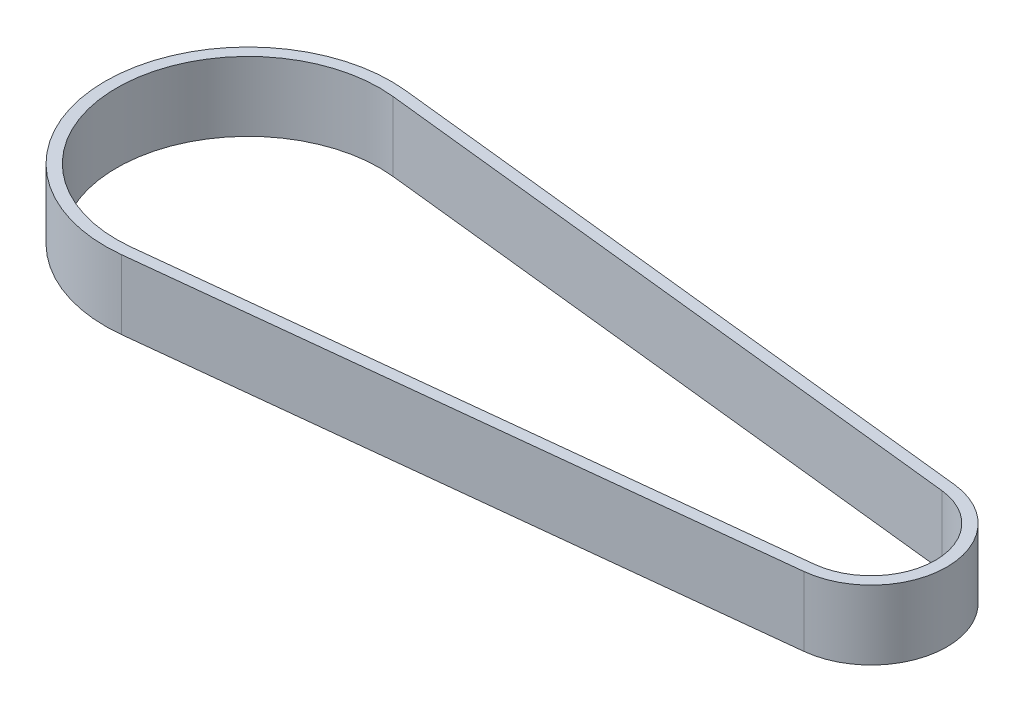
ISO-10303-21;
HEADER;
FILE_DESCRIPTION(('STEP AP214'),'2;1');
FILE_NAME('part.step','',(''),(''),'','','');
FILE_SCHEMA(('AUTOMOTIVE_DESIGN { 1 0 10303 214 1 1 1 1 }'));
ENDSEC;
DATA;
#1=APPLICATION_CONTEXT('core data for automotive mechanical design processes');
#2=APPLICATION_PROTOCOL_DEFINITION('international standard','automotive_design',2000,#1);
#3=PRODUCT_CONTEXT('',#1,'mechanical');
#4=PRODUCT('Part','Part','',(#3));
#5=PRODUCT_RELATED_PRODUCT_CATEGORY('part','',(#4));
#6=PRODUCT_DEFINITION_FORMATION('','',#4);
#7=PRODUCT_DEFINITION_CONTEXT('part definition',#1,'design');
#8=PRODUCT_DEFINITION('design','',#6,#7);
#9=PRODUCT_DEFINITION_SHAPE('','',#8);
#10=(LENGTH_UNIT() NAMED_UNIT(*) SI_UNIT(.MILLI.,.METRE.));
#11=(NAMED_UNIT(*) PLANE_ANGLE_UNIT() SI_UNIT($,.RADIAN.));
#12=(NAMED_UNIT(*) SI_UNIT($,.STERADIAN.) SOLID_ANGLE_UNIT());
#13=UNCERTAINTY_MEASURE_WITH_UNIT(LENGTH_MEASURE(1.E-05),#10,'distance_accuracy_value','');
#14=(GEOMETRIC_REPRESENTATION_CONTEXT(3) GLOBAL_UNCERTAINTY_ASSIGNED_CONTEXT((#13)) GLOBAL_UNIT_ASSIGNED_CONTEXT((#10,
#11,#12)) REPRESENTATION_CONTEXT('',''));
#15=CARTESIAN_POINT('',(0.,0.,0.));
#16=DIRECTION('',(0.,0.,1.));
#17=DIRECTION('',(1.,0.,0.));
#18=AXIS2_PLACEMENT_3D('',#15,#16,#17);
#19=CARTESIAN_POINT('',(-51.763176794887,6.,0.));
#20=DIRECTION('',(0.,1.,0.));
#21=DIRECTION('',(0.,0.,1.));
#22=AXIS2_PLACEMENT_3D('',#19,#20,#21);
#23=PLANE('',#22);
#24=CARTESIAN_POINT('',(-51.763176794887,6.,0.));
#25=DIRECTION('',(0.,1.,0.));
#26=DIRECTION('',(0.,0.,1.));
#27=AXIS2_PLACEMENT_3D('',#24,#25,#26);
#28=CIRCLE('',#27,12.39);
#29=CARTESIAN_POINT('',(-50.4255156837759,6.,-12.317579419343));
#30=VERTEX_POINT('',#29);
#31=CARTESIAN_POINT('',(-50.4255156837759,6.,12.317579419343));
#32=VERTEX_POINT('',#31);
#33=EDGE_CURVE('E133',#30,#32,#28,.T.);
#34=ORIENTED_EDGE('',*,*,#33,.T.);
#35=DIRECTION('',(0.994154916815412,0.,-0.107962962962963));
#36=VECTOR('',#35,1.);
#37=CARTESIAN_POINT('',(-50.4255156837759,6.,12.317579419343));
#38=LINE('',#37,#36);
#39=CARTESIAN_POINT('',(2.94506024215,6.,6.5216562543091));
#40=VERTEX_POINT('',#39);
#41=EDGE_CURVE('E136',#32,#40,#38,.T.);
#42=ORIENTED_EDGE('',*,*,#41,.T.);
#43=CARTESIAN_POINT('',(2.23682320511296,6.,0.));
#44=DIRECTION('',(0.,1.,0.));
#45=DIRECTION('',(0.,0.,1.));
#46=AXIS2_PLACEMENT_3D('',#43,#44,#45);
#47=CIRCLE('',#46,6.56);
#48=CARTESIAN_POINT('',(2.94506024215,6.,-6.5216562543091));
#49=VERTEX_POINT('',#48);
#50=EDGE_CURVE('E139',#40,#49,#47,.T.);
#51=ORIENTED_EDGE('',*,*,#50,.T.);
#52=DIRECTION('',(-0.994154916815412,0.,-0.107962962962963));
#53=VECTOR('',#52,1.);
#54=CARTESIAN_POINT('',(2.94506024215,6.,-6.5216562543091));
#55=LINE('',#54,#53);
#56=EDGE_CURVE('E141',#49,#30,#55,.T.);
#57=ORIENTED_EDGE('',*,*,#56,.T.);
#58=EDGE_LOOP('',(#34,#42,#51,#57));
#59=FACE_BOUND('',#58,.T.);
#60=DIRECTION('',(-0.994154916815412,0.,-0.107962962962963));
#61=VECTOR('',#60,1.);
#62=CARTESIAN_POINT('',(2.83709727918703,6.,-5.52750133749369));
#63=LINE('',#62,#61);
#64=CARTESIAN_POINT('',(2.83709727918703,6.,-5.52750133749369));
#65=VERTEX_POINT('',#64);
#66=CARTESIAN_POINT('',(-50.5334786467389,6.,-11.3234245025275));
#67=VERTEX_POINT('',#66);
#68=EDGE_CURVE('E105',#65,#67,#63,.T.);
#69=ORIENTED_EDGE('',*,*,#68,.F.);
#70=CARTESIAN_POINT('',(2.23682320511296,6.,0.));
#71=DIRECTION('',(0.,1.,0.));
#72=DIRECTION('',(0.,0.,1.));
#73=AXIS2_PLACEMENT_3D('',#70,#71,#72);
#74=CIRCLE('',#73,5.56);
#75=CARTESIAN_POINT('',(2.83709727918703,6.,5.52750133749369));
#76=VERTEX_POINT('',#75);
#77=EDGE_CURVE('E97',#76,#65,#74,.T.);
#78=ORIENTED_EDGE('',*,*,#77,.F.);
#79=DIRECTION('',(0.994154916815412,0.,-0.107962962962963));
#80=VECTOR('',#79,1.);
#81=CARTESIAN_POINT('',(-50.5334786467389,6.,11.3234245025275));
#82=LINE('',#81,#80);
#83=CARTESIAN_POINT('',(-50.5334786467389,6.,11.3234245025275));
#84=VERTEX_POINT('',#83);
#85=EDGE_CURVE('E119',#84,#76,#82,.T.);
#86=ORIENTED_EDGE('',*,*,#85,.F.);
#87=CARTESIAN_POINT('',(-51.763176794887,6.,0.));
#88=DIRECTION('',(0.,1.,0.));
#89=DIRECTION('',(0.,0.,1.));
#90=AXIS2_PLACEMENT_3D('',#87,#88,#89);
#91=CIRCLE('',#90,11.39);
#92=EDGE_CURVE('E117',#67,#84,#91,.T.);
#93=ORIENTED_EDGE('',*,*,#92,.F.);
#94=EDGE_LOOP('',(#69,#78,#86,#93));
#95=FACE_BOUND('',#94,.T.);
#96=ADVANCED_FACE('F32',(#59,#95),#23,.T.);
#97=CARTESIAN_POINT('',(-51.763176794887,0.,0.));
#98=DIRECTION('',(0.,1.,0.));
#99=DIRECTION('',(0.,0.,1.));
#100=AXIS2_PLACEMENT_3D('',#97,#98,#99);
#101=PLANE('',#100);
#102=CARTESIAN_POINT('',(-51.763176794887,0.,0.));
#103=DIRECTION('',(0.,1.,0.));
#104=DIRECTION('',(0.,0.,1.));
#105=AXIS2_PLACEMENT_3D('',#102,#103,#104);
#106=CIRCLE('',#105,12.39);
#107=CARTESIAN_POINT('',(-50.4255156837759,0.,-12.317579419343));
#108=VERTEX_POINT('',#107);
#109=CARTESIAN_POINT('',(-50.4255156837759,0.,12.317579419343));
#110=VERTEX_POINT('',#109);
#111=EDGE_CURVE('E113',#108,#110,#106,.T.);
#112=ORIENTED_EDGE('',*,*,#111,.F.);
#113=DIRECTION('',(-0.994154916815412,0.,-0.107962962962963));
#114=VECTOR('',#113,1.);
#115=CARTESIAN_POINT('',(2.94506024215,0.,-6.5216562543091));
#116=LINE('',#115,#114);
#117=CARTESIAN_POINT('',(2.94506024215,0.,-6.5216562543091));
#118=VERTEX_POINT('',#117);
#119=EDGE_CURVE('E137',#118,#108,#116,.T.);
#120=ORIENTED_EDGE('',*,*,#119,.F.);
#121=CARTESIAN_POINT('',(2.23682320511296,0.,0.));
#122=DIRECTION('',(0.,1.,0.));
#123=DIRECTION('',(0.,0.,1.));
#124=AXIS2_PLACEMENT_3D('',#121,#122,#123);
#125=CIRCLE('',#124,6.56);
#126=CARTESIAN_POINT('',(2.94506024215,0.,6.5216562543091));
#127=VERTEX_POINT('',#126);
#128=EDGE_CURVE('E148',#127,#118,#125,.T.);
#129=ORIENTED_EDGE('',*,*,#128,.F.);
#130=DIRECTION('',(0.994154916815412,0.,-0.107962962962963));
#131=VECTOR('',#130,1.);
#132=CARTESIAN_POINT('',(-50.4255156837759,0.,12.317579419343));
#133=LINE('',#132,#131);
#134=EDGE_CURVE('E146',#110,#127,#133,.T.);
#135=ORIENTED_EDGE('',*,*,#134,.F.);
#136=EDGE_LOOP('',(#112,#120,#129,#135));
#137=FACE_BOUND('',#136,.T.);
#138=CARTESIAN_POINT('',(2.23682320511296,0.,0.));
#139=DIRECTION('',(0.,1.,0.));
#140=DIRECTION('',(0.,0.,1.));
#141=AXIS2_PLACEMENT_3D('',#138,#139,#140);
#142=CIRCLE('',#141,5.56);
#143=CARTESIAN_POINT('',(2.83709727918704,0.,5.52750133749369));
#144=VERTEX_POINT('',#143);
#145=CARTESIAN_POINT('',(2.83709727918703,0.,-5.52750133749369));
#146=VERTEX_POINT('',#145);
#147=EDGE_CURVE('E55',#144,#146,#142,.T.);
#148=ORIENTED_EDGE('',*,*,#147,.T.);
#149=DIRECTION('',(-0.994154916815412,0.,-0.107962962962963));
#150=VECTOR('',#149,1.);
#151=CARTESIAN_POINT('',(2.83709727918703,0.,-5.52750133749369));
#152=LINE('',#151,#150);
#153=CARTESIAN_POINT('',(-50.5334786467389,0.,-11.3234245025275));
#154=VERTEX_POINT('',#153);
#155=EDGE_CURVE('E112',#146,#154,#152,.T.);
#156=ORIENTED_EDGE('',*,*,#155,.T.);
#157=CARTESIAN_POINT('',(-51.763176794887,0.,0.));
#158=DIRECTION('',(0.,1.,0.));
#159=DIRECTION('',(0.,0.,1.));
#160=AXIS2_PLACEMENT_3D('',#157,#158,#159);
#161=CIRCLE('',#160,11.39);
#162=CARTESIAN_POINT('',(-50.5334786467389,0.,11.3234245025275));
#163=VERTEX_POINT('',#162);
#164=EDGE_CURVE('E125',#154,#163,#161,.T.);
#165=ORIENTED_EDGE('',*,*,#164,.T.);
#166=DIRECTION('',(0.994154916815412,0.,-0.107962962962963));
#167=VECTOR('',#166,1.);
#168=CARTESIAN_POINT('',(-50.5334786467389,0.,11.3234245025275));
#169=LINE('',#168,#167);
#170=EDGE_CURVE('E106',#163,#144,#169,.T.);
#171=ORIENTED_EDGE('',*,*,#170,.T.);
#172=EDGE_LOOP('',(#148,#156,#165,#171));
#173=FACE_BOUND('',#172,.T.);
#174=ADVANCED_FACE('F166',(#137,#173),#101,.F.);
#175=CARTESIAN_POINT('',(-51.763176794887,6.,0.));
#176=DIRECTION('',(0.,-1.,0.));
#177=DIRECTION('',(0.,0.,-1.));
#178=AXIS2_PLACEMENT_3D('',#175,#176,#177);
#179=CYLINDRICAL_SURFACE('',#178,12.39);
#180=ORIENTED_EDGE('',*,*,#111,.T.);
#181=DIRECTION('',(0.,-1.,0.));
#182=VECTOR('',#181,1.);
#183=CARTESIAN_POINT('',(-50.4255156837759,6.,12.317579419343));
#184=LINE('',#183,#182);
#185=EDGE_CURVE('E11',#32,#110,#184,.T.);
#186=ORIENTED_EDGE('',*,*,#185,.F.);
#187=ORIENTED_EDGE('',*,*,#33,.F.);
#188=DIRECTION('',(0.,-1.,0.));
#189=VECTOR('',#188,1.);
#190=CARTESIAN_POINT('',(-50.4255156837759,6.,-12.317579419343));
#191=LINE('',#190,#189);
#192=EDGE_CURVE('E143',#30,#108,#191,.T.);
#193=ORIENTED_EDGE('',*,*,#192,.T.);
#194=EDGE_LOOP('',(#180,#186,#187,#193));
#195=FACE_BOUND('',#194,.T.);
#196=ADVANCED_FACE('F34',(#195),#179,.T.);
#197=CARTESIAN_POINT('',(-50.4255156837759,6.,12.317579419343));
#198=DIRECTION('',(-0.107962962962963,0.,-0.994154916815412));
#199=DIRECTION('',(-0.994154916815412,0.,0.107962962962963));
#200=AXIS2_PLACEMENT_3D('',#197,#198,#199);
#201=PLANE('',#200);
#202=ORIENTED_EDGE('',*,*,#134,.T.);
#203=DIRECTION('',(0.,-1.,0.));
#204=VECTOR('',#203,1.);
#205=CARTESIAN_POINT('',(2.94506024215,6.,6.5216562543091));
#206=LINE('',#205,#204);
#207=EDGE_CURVE('E40',#40,#127,#206,.T.);
#208=ORIENTED_EDGE('',*,*,#207,.F.);
#209=ORIENTED_EDGE('',*,*,#41,.F.);
#210=ORIENTED_EDGE('',*,*,#185,.T.);
#211=EDGE_LOOP('',(#202,#208,#209,#210));
#212=FACE_BOUND('',#211,.T.);
#213=ADVANCED_FACE('F176',(#212),#201,.F.);
#214=CARTESIAN_POINT('',(2.23682320511296,6.,0.));
#215=DIRECTION('',(0.,-1.,0.));
#216=DIRECTION('',(0.,0.,-1.));
#217=AXIS2_PLACEMENT_3D('',#214,#215,#216);
#218=CYLINDRICAL_SURFACE('',#217,6.56);
#219=ORIENTED_EDGE('',*,*,#128,.T.);
#220=DIRECTION('',(0.,-1.,0.));
#221=VECTOR('',#220,1.);
#222=CARTESIAN_POINT('',(2.94506024215,6.,-6.5216562543091));
#223=LINE('',#222,#221);
#224=EDGE_CURVE('E153',#49,#118,#223,.T.);
#225=ORIENTED_EDGE('',*,*,#224,.F.);
#226=ORIENTED_EDGE('',*,*,#50,.F.);
#227=ORIENTED_EDGE('',*,*,#207,.T.);
#228=EDGE_LOOP('',(#219,#225,#226,#227));
#229=FACE_BOUND('',#228,.T.);
#230=ADVANCED_FACE('F160',(#229),#218,.T.);
#231=CARTESIAN_POINT('',(2.94506024215,6.,-6.5216562543091));
#232=DIRECTION('',(-0.107962962962963,0.,0.994154916815412));
#233=DIRECTION('',(0.994154916815412,0.,0.107962962962963));
#234=AXIS2_PLACEMENT_3D('',#231,#232,#233);
#235=PLANE('',#234);
#236=ORIENTED_EDGE('',*,*,#119,.T.);
#237=ORIENTED_EDGE('',*,*,#192,.F.);
#238=ORIENTED_EDGE('',*,*,#56,.F.);
#239=ORIENTED_EDGE('',*,*,#224,.T.);
#240=EDGE_LOOP('',(#236,#237,#238,#239));
#241=FACE_BOUND('',#240,.T.);
#242=ADVANCED_FACE('F170',(#241),#235,.F.);
#243=CARTESIAN_POINT('',(2.23682320511296,6.,0.));
#244=DIRECTION('',(0.,-1.,0.));
#245=DIRECTION('',(0.,0.,-1.));
#246=AXIS2_PLACEMENT_3D('',#243,#244,#245);
#247=CYLINDRICAL_SURFACE('',#246,5.56);
#248=ORIENTED_EDGE('',*,*,#147,.F.);
#249=DIRECTION('',(0.,-1.,0.));
#250=VECTOR('',#249,1.);
#251=CARTESIAN_POINT('',(2.83709727918703,6.,5.52750133749369));
#252=LINE('',#251,#250);
#253=EDGE_CURVE('E101',#76,#144,#252,.T.);
#254=ORIENTED_EDGE('',*,*,#253,.F.);
#255=ORIENTED_EDGE('',*,*,#77,.T.);
#256=DIRECTION('',(0.,-1.,0.));
#257=VECTOR('',#256,1.);
#258=CARTESIAN_POINT('',(2.83709727918703,6.,-5.52750133749369));
#259=LINE('',#258,#257);
#260=EDGE_CURVE('E100',#65,#146,#259,.T.);
#261=ORIENTED_EDGE('',*,*,#260,.T.);
#262=EDGE_LOOP('',(#248,#254,#255,#261));
#263=FACE_BOUND('',#262,.T.);
#264=ADVANCED_FACE('F99',(#263),#247,.F.);
#265=CARTESIAN_POINT('',(2.83709727918703,6.,-5.52750133749369));
#266=DIRECTION('',(-0.107962962962963,0.,0.994154916815412));
#267=DIRECTION('',(0.994154916815412,0.,0.107962962962963));
#268=AXIS2_PLACEMENT_3D('',#265,#266,#267);
#269=PLANE('',#268);
#270=ORIENTED_EDGE('',*,*,#155,.F.);
#271=ORIENTED_EDGE('',*,*,#260,.F.);
#272=ORIENTED_EDGE('',*,*,#68,.T.);
#273=DIRECTION('',(0.,-1.,0.));
#274=VECTOR('',#273,1.);
#275=CARTESIAN_POINT('',(-50.5334786467389,6.,-11.3234245025275));
#276=LINE('',#275,#274);
#277=EDGE_CURVE('E114',#67,#154,#276,.T.);
#278=ORIENTED_EDGE('',*,*,#277,.T.);
#279=EDGE_LOOP('',(#270,#271,#272,#278));
#280=FACE_BOUND('',#279,.T.);
#281=ADVANCED_FACE('F109',(#280),#269,.T.);
#282=CARTESIAN_POINT('',(-51.763176794887,6.,0.));
#283=DIRECTION('',(0.,-1.,0.));
#284=DIRECTION('',(0.,0.,-1.));
#285=AXIS2_PLACEMENT_3D('',#282,#283,#284);
#286=CYLINDRICAL_SURFACE('',#285,11.39);
#287=ORIENTED_EDGE('',*,*,#164,.F.);
#288=ORIENTED_EDGE('',*,*,#277,.F.);
#289=ORIENTED_EDGE('',*,*,#92,.T.);
#290=DIRECTION('',(0.,-1.,0.));
#291=VECTOR('',#290,1.);
#292=CARTESIAN_POINT('',(-50.5334786467389,6.,11.3234245025275));
#293=LINE('',#292,#291);
#294=EDGE_CURVE('E47',#84,#163,#293,.T.);
#295=ORIENTED_EDGE('',*,*,#294,.T.);
#296=EDGE_LOOP('',(#287,#288,#289,#295));
#297=FACE_BOUND('',#296,.T.);
#298=ADVANCED_FACE('F199',(#297),#286,.F.);
#299=CARTESIAN_POINT('',(-50.5334786467389,6.,11.3234245025275));
#300=DIRECTION('',(-0.107962962962963,0.,-0.994154916815412));
#301=DIRECTION('',(-0.994154916815412,0.,0.107962962962963));
#302=AXIS2_PLACEMENT_3D('',#299,#300,#301);
#303=PLANE('',#302);
#304=ORIENTED_EDGE('',*,*,#170,.F.);
#305=ORIENTED_EDGE('',*,*,#294,.F.);
#306=ORIENTED_EDGE('',*,*,#85,.T.);
#307=ORIENTED_EDGE('',*,*,#253,.T.);
#308=EDGE_LOOP('',(#304,#305,#306,#307));
#309=FACE_BOUND('',#308,.T.);
#310=ADVANCED_FACE('F203',(#309),#303,.T.);
#311=CLOSED_SHELL('',(#96,#174,#196,#213,#230,#242,#264,#281,#298,#310));
#312=MANIFOLD_SOLID_BREP('B2',#311);
#313=ADVANCED_BREP_SHAPE_REPRESENTATION('',(#18,#312),#14);
#314=SHAPE_DEFINITION_REPRESENTATION(#9,#313);
ENDSEC;
END-ISO-10303-21;
